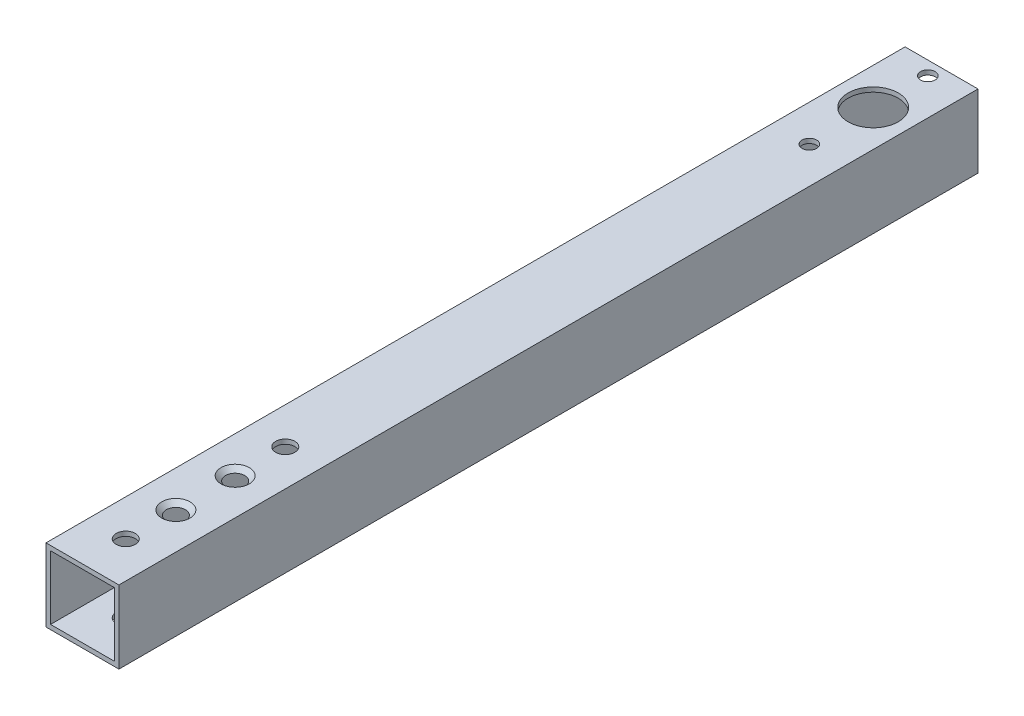
ISO-10303-21;
HEADER;
FILE_DESCRIPTION(('STEP AP214'),'2;1');
FILE_NAME('part.step','',(''),(''),'','','');
FILE_SCHEMA(('AUTOMOTIVE_DESIGN { 1 0 10303 214 1 1 1 1 }'));
ENDSEC;
DATA;
#1=APPLICATION_CONTEXT('core data for automotive mechanical design processes');
#2=APPLICATION_PROTOCOL_DEFINITION('international standard','automotive_design',2000,#1);
#3=PRODUCT_CONTEXT('',#1,'mechanical');
#4=PRODUCT('Part','Part','',(#3));
#5=PRODUCT_RELATED_PRODUCT_CATEGORY('part','',(#4));
#6=PRODUCT_DEFINITION_FORMATION('','',#4);
#7=PRODUCT_DEFINITION_CONTEXT('part definition',#1,'design');
#8=PRODUCT_DEFINITION('design','',#6,#7);
#9=PRODUCT_DEFINITION_SHAPE('','',#8);
#10=(LENGTH_UNIT() NAMED_UNIT(*) SI_UNIT(.MILLI.,.METRE.));
#11=(NAMED_UNIT(*) PLANE_ANGLE_UNIT() SI_UNIT($,.RADIAN.));
#12=(NAMED_UNIT(*) SI_UNIT($,.STERADIAN.) SOLID_ANGLE_UNIT());
#13=UNCERTAINTY_MEASURE_WITH_UNIT(LENGTH_MEASURE(1.E-05),#10,'distance_accuracy_value','');
#14=(GEOMETRIC_REPRESENTATION_CONTEXT(3) GLOBAL_UNCERTAINTY_ASSIGNED_CONTEXT((#13)) GLOBAL_UNIT_ASSIGNED_CONTEXT((#10,
#11,#12)) REPRESENTATION_CONTEXT('',''));
#15=CARTESIAN_POINT('',(0.,0.,0.));
#16=DIRECTION('',(0.,0.,1.));
#17=DIRECTION('',(1.,0.,0.));
#18=AXIS2_PLACEMENT_3D('',#15,#16,#17);
#19=CARTESIAN_POINT('',(8.,-8.,-86.1274169979696));
#20=DIRECTION('',(1.,0.,0.));
#21=DIRECTION('',(0.,0.,-1.));
#22=AXIS2_PLACEMENT_3D('',#19,#20,#21);
#23=PLANE('',#22);
#24=DIRECTION('',(0.,0.,1.));
#25=VECTOR('',#24,1.);
#26=CARTESIAN_POINT('',(8.,-8.,-86.1274169979696));
#27=LINE('',#26,#25);
#28=CARTESIAN_POINT('',(7.99999999999999,-8.,-63.5));
#29=VERTEX_POINT('',#28);
#30=CARTESIAN_POINT('',(8.,-8.,125.));
#31=VERTEX_POINT('',#30);
#32=EDGE_CURVE('E178',#29,#31,#27,.T.);
#33=ORIENTED_EDGE('',*,*,#32,.F.);
#34=DIRECTION('',(0.,1.,0.));
#35=VECTOR('',#34,1.);
#36=CARTESIAN_POINT('',(8.,-8.,-63.5));
#37=LINE('',#36,#35);
#38=CARTESIAN_POINT('',(8.,8.,-63.5));
#39=VERTEX_POINT('',#38);
#40=EDGE_CURVE('E175',#29,#39,#37,.T.);
#41=ORIENTED_EDGE('',*,*,#40,.T.);
#42=DIRECTION('',(0.,0.,1.));
#43=VECTOR('',#42,1.);
#44=CARTESIAN_POINT('',(8.,8.,-86.1274169979696));
#45=LINE('',#44,#43);
#46=CARTESIAN_POINT('',(8.,8.,125.));
#47=VERTEX_POINT('',#46);
#48=EDGE_CURVE('E179',#39,#47,#45,.T.);
#49=ORIENTED_EDGE('',*,*,#48,.T.);
#50=DIRECTION('',(0.,1.,0.));
#51=VECTOR('',#50,1.);
#52=CARTESIAN_POINT('',(8.,-8.,125.));
#53=LINE('',#52,#51);
#54=EDGE_CURVE('E161',#31,#47,#53,.T.);
#55=ORIENTED_EDGE('',*,*,#54,.F.);
#56=EDGE_LOOP('',(#33,#41,#49,#55));
#57=FACE_BOUND('',#56,.T.);
#58=ADVANCED_FACE('F48',(#57),#23,.T.);
#59=CARTESIAN_POINT('',(-8.,-8.,-86.1274169979696));
#60=DIRECTION('',(0.,-1.,0.));
#61=DIRECTION('',(0.,0.,-1.));
#62=AXIS2_PLACEMENT_3D('',#59,#60,#61);
#63=PLANE('',#62);
#64=CARTESIAN_POINT('',(0.,-8.,104.5));
#65=DIRECTION('',(0.,-1.,0.));
#66=DIRECTION('',(0.,0.,-1.));
#67=AXIS2_PLACEMENT_3D('',#64,#65,#66);
#68=CIRCLE('',#67,3.10000000000003);
#69=CARTESIAN_POINT('',(0.,-8.,101.4));
#70=VERTEX_POINT('',#69);
#71=EDGE_CURVE('E243',#70,#70,#68,.F.);
#72=ORIENTED_EDGE('',*,*,#71,.T.);
#73=EDGE_LOOP('',(#72));
#74=FACE_BOUND('',#73,.T.);
#75=CARTESIAN_POINT('',(0.,-8.,91.5));
#76=DIRECTION('',(0.,-1.,0.));
#77=DIRECTION('',(0.,0.,-1.));
#78=AXIS2_PLACEMENT_3D('',#75,#76,#77);
#79=CIRCLE('',#78,3.10000000000003);
#80=CARTESIAN_POINT('',(0.,-8.,88.3999999999999));
#81=VERTEX_POINT('',#80);
#82=EDGE_CURVE('E212',#81,#81,#79,.F.);
#83=ORIENTED_EDGE('',*,*,#82,.T.);
#84=EDGE_LOOP('',(#83));
#85=FACE_BOUND('',#84,.T.);
#86=CARTESIAN_POINT('',(0.,-8.,115.5));
#87=DIRECTION('',(0.,1.,0.));
#88=DIRECTION('',(0.,0.,1.));
#89=AXIS2_PLACEMENT_3D('',#86,#87,#88);
#90=CIRCLE('',#89,2.1);
#91=CARTESIAN_POINT('',(0.,-8.,117.6));
#92=VERTEX_POINT('',#91);
#93=EDGE_CURVE('E220',#92,#92,#90,.T.);
#94=ORIENTED_EDGE('',*,*,#93,.T.);
#95=EDGE_LOOP('',(#94));
#96=FACE_BOUND('',#95,.T.);
#97=CARTESIAN_POINT('',(0.,-8.,80.5));
#98=DIRECTION('',(0.,1.,0.));
#99=DIRECTION('',(0.,0.,1.));
#100=AXIS2_PLACEMENT_3D('',#97,#98,#99);
#101=CIRCLE('',#100,2.1);
#102=CARTESIAN_POINT('',(0.,-8.,82.6));
#103=VERTEX_POINT('',#102);
#104=EDGE_CURVE('E467',#103,#103,#101,.T.);
#105=ORIENTED_EDGE('',*,*,#104,.T.);
#106=EDGE_LOOP('',(#105));
#107=FACE_BOUND('',#106,.T.);
#108=CARTESIAN_POINT('',(0.,-8.,-48.5));
#109=DIRECTION('',(0.,1.,0.));
#110=DIRECTION('',(0.,0.,1.));
#111=AXIS2_PLACEMENT_3D('',#108,#109,#110);
#112=CIRCLE('',#111,5.5);
#113=CARTESIAN_POINT('',(0.,-8.,-43.));
#114=VERTEX_POINT('',#113);
#115=EDGE_CURVE('E394',#114,#114,#112,.T.);
#116=ORIENTED_EDGE('',*,*,#115,.T.);
#117=EDGE_LOOP('',(#116));
#118=FACE_BOUND('',#117,.T.);
#119=CARTESIAN_POINT('',(0.,-8.,-60.5));
#120=DIRECTION('',(0.,1.,0.));
#121=DIRECTION('',(0.,0.,1.));
#122=AXIS2_PLACEMENT_3D('',#119,#120,#121);
#123=CIRCLE('',#122,1.60000000000002);
#124=CARTESIAN_POINT('',(0.,-8.,-58.9));
#125=VERTEX_POINT('',#124);
#126=EDGE_CURVE('E458',#125,#125,#123,.T.);
#127=ORIENTED_EDGE('',*,*,#126,.T.);
#128=EDGE_LOOP('',(#127));
#129=FACE_BOUND('',#128,.T.);
#130=CARTESIAN_POINT('',(0.,-8.,-34.5));
#131=DIRECTION('',(0.,1.,0.));
#132=DIRECTION('',(0.,0.,1.));
#133=AXIS2_PLACEMENT_3D('',#130,#131,#132);
#134=CIRCLE('',#133,1.60000000000001);
#135=CARTESIAN_POINT('',(0.,-8.,-32.9));
#136=VERTEX_POINT('',#135);
#137=EDGE_CURVE('E404',#136,#136,#134,.T.);
#138=ORIENTED_EDGE('',*,*,#137,.T.);
#139=EDGE_LOOP('',(#138));
#140=FACE_BOUND('',#139,.T.);
#141=DIRECTION('',(0.,0.,1.));
#142=VECTOR('',#141,1.);
#143=CARTESIAN_POINT('',(-8.,-8.,-86.1274169979696));
#144=LINE('',#143,#142);
#145=CARTESIAN_POINT('',(-8.00000000000001,-8.,-63.5));
#146=VERTEX_POINT('',#145);
#147=CARTESIAN_POINT('',(-8.,-8.,125.));
#148=VERTEX_POINT('',#147);
#149=EDGE_CURVE('E185',#146,#148,#144,.T.);
#150=ORIENTED_EDGE('',*,*,#149,.F.);
#151=DIRECTION('',(1.,0.,0.));
#152=VECTOR('',#151,1.);
#153=CARTESIAN_POINT('',(-8.,-8.,-63.5));
#154=LINE('',#153,#152);
#155=EDGE_CURVE('E92',#146,#29,#154,.T.);
#156=ORIENTED_EDGE('',*,*,#155,.T.);
#157=ORIENTED_EDGE('',*,*,#32,.T.);
#158=DIRECTION('',(1.,0.,0.));
#159=VECTOR('',#158,1.);
#160=CARTESIAN_POINT('',(-8.,-8.,125.));
#161=LINE('',#160,#159);
#162=EDGE_CURVE('E172',#148,#31,#161,.T.);
#163=ORIENTED_EDGE('',*,*,#162,.F.);
#164=EDGE_LOOP('',(#150,#156,#157,#163));
#165=FACE_BOUND('',#164,.T.);
#166=ADVANCED_FACE('F313',(#74,#85,#96,#107,#118,#129,#140,#165),#63,.T.);
#167=CARTESIAN_POINT('',(-8.,-8.,-86.1274169979696));
#168=DIRECTION('',(-1.,0.,0.));
#169=DIRECTION('',(0.,0.,1.));
#170=AXIS2_PLACEMENT_3D('',#167,#168,#169);
#171=PLANE('',#170);
#172=DIRECTION('',(0.,0.,1.));
#173=VECTOR('',#172,1.);
#174=CARTESIAN_POINT('',(-8.,8.,-86.1274169979696));
#175=LINE('',#174,#173);
#176=CARTESIAN_POINT('',(-8.,8.,-63.5));
#177=VERTEX_POINT('',#176);
#178=CARTESIAN_POINT('',(-8.,8.,125.));
#179=VERTEX_POINT('',#178);
#180=EDGE_CURVE('E189',#177,#179,#175,.T.);
#181=ORIENTED_EDGE('',*,*,#180,.F.);
#182=DIRECTION('',(0.,-1.,0.));
#183=VECTOR('',#182,1.);
#184=CARTESIAN_POINT('',(-8.,-8.,-63.5));
#185=LINE('',#184,#183);
#186=EDGE_CURVE('E84',#177,#146,#185,.T.);
#187=ORIENTED_EDGE('',*,*,#186,.T.);
#188=ORIENTED_EDGE('',*,*,#149,.T.);
#189=DIRECTION('',(0.,-1.,0.));
#190=VECTOR('',#189,1.);
#191=CARTESIAN_POINT('',(-8.,-8.,125.));
#192=LINE('',#191,#190);
#193=EDGE_CURVE('E168',#179,#148,#192,.T.);
#194=ORIENTED_EDGE('',*,*,#193,.F.);
#195=EDGE_LOOP('',(#181,#187,#188,#194));
#196=FACE_BOUND('',#195,.T.);
#197=ADVANCED_FACE('F319',(#196),#171,.T.);
#198=CARTESIAN_POINT('',(-8.,8.,-86.1274169979696));
#199=DIRECTION('',(0.,1.,0.));
#200=DIRECTION('',(0.,0.,1.));
#201=AXIS2_PLACEMENT_3D('',#198,#199,#200);
#202=PLANE('',#201);
#203=CARTESIAN_POINT('',(0.,8.,104.5));
#204=DIRECTION('',(0.,1.,0.));
#205=DIRECTION('',(0.,0.,1.));
#206=AXIS2_PLACEMENT_3D('',#203,#204,#205);
#207=CIRCLE('',#206,3.10000000000002);
#208=CARTESIAN_POINT('',(0.,8.,107.6));
#209=VERTEX_POINT('',#208);
#210=EDGE_CURVE('E11',#209,#209,#207,.F.);
#211=ORIENTED_EDGE('',*,*,#210,.T.);
#212=EDGE_LOOP('',(#211));
#213=FACE_BOUND('',#212,.T.);
#214=CARTESIAN_POINT('',(0.,8.,91.5));
#215=DIRECTION('',(0.,1.,0.));
#216=DIRECTION('',(0.,0.,1.));
#217=AXIS2_PLACEMENT_3D('',#214,#215,#216);
#218=CIRCLE('',#217,3.10000000000002);
#219=CARTESIAN_POINT('',(0.,8.,94.6));
#220=VERTEX_POINT('',#219);
#221=EDGE_CURVE('E59',#220,#220,#218,.F.);
#222=ORIENTED_EDGE('',*,*,#221,.T.);
#223=EDGE_LOOP('',(#222));
#224=FACE_BOUND('',#223,.T.);
#225=CARTESIAN_POINT('',(0.,8.,115.5));
#226=DIRECTION('',(0.,1.,0.));
#227=DIRECTION('',(0.,0.,1.));
#228=AXIS2_PLACEMENT_3D('',#225,#226,#227);
#229=CIRCLE('',#228,2.1);
#230=CARTESIAN_POINT('',(0.,8.,117.6));
#231=VERTEX_POINT('',#230);
#232=EDGE_CURVE('E393',#231,#231,#229,.T.);
#233=ORIENTED_EDGE('',*,*,#232,.F.);
#234=EDGE_LOOP('',(#233));
#235=FACE_BOUND('',#234,.T.);
#236=CARTESIAN_POINT('',(0.,8.,80.5));
#237=DIRECTION('',(0.,1.,0.));
#238=DIRECTION('',(0.,0.,1.));
#239=AXIS2_PLACEMENT_3D('',#236,#237,#238);
#240=CIRCLE('',#239,2.1);
#241=CARTESIAN_POINT('',(0.,8.,82.6));
#242=VERTEX_POINT('',#241);
#243=EDGE_CURVE('E439',#242,#242,#240,.T.);
#244=ORIENTED_EDGE('',*,*,#243,.F.);
#245=EDGE_LOOP('',(#244));
#246=FACE_BOUND('',#245,.T.);
#247=CARTESIAN_POINT('',(0.,8.,-48.5));
#248=DIRECTION('',(0.,1.,0.));
#249=DIRECTION('',(0.,0.,1.));
#250=AXIS2_PLACEMENT_3D('',#247,#248,#249);
#251=CIRCLE('',#250,5.5);
#252=CARTESIAN_POINT('',(0.,8.,-43.));
#253=VERTEX_POINT('',#252);
#254=EDGE_CURVE('E390',#253,#253,#251,.T.);
#255=ORIENTED_EDGE('',*,*,#254,.F.);
#256=EDGE_LOOP('',(#255));
#257=FACE_BOUND('',#256,.T.);
#258=CARTESIAN_POINT('',(0.,8.,-60.5));
#259=DIRECTION('',(0.,1.,0.));
#260=DIRECTION('',(0.,0.,1.));
#261=AXIS2_PLACEMENT_3D('',#258,#259,#260);
#262=CIRCLE('',#261,1.60000000000002);
#263=CARTESIAN_POINT('',(0.,8.,-58.9));
#264=VERTEX_POINT('',#263);
#265=EDGE_CURVE('E401',#264,#264,#262,.T.);
#266=ORIENTED_EDGE('',*,*,#265,.F.);
#267=EDGE_LOOP('',(#266));
#268=FACE_BOUND('',#267,.T.);
#269=CARTESIAN_POINT('',(0.,8.,-34.5));
#270=DIRECTION('',(0.,1.,0.));
#271=DIRECTION('',(0.,0.,1.));
#272=AXIS2_PLACEMENT_3D('',#269,#270,#271);
#273=CIRCLE('',#272,1.60000000000001);
#274=CARTESIAN_POINT('',(0.,8.,-32.9));
#275=VERTEX_POINT('',#274);
#276=EDGE_CURVE('E446',#275,#275,#273,.T.);
#277=ORIENTED_EDGE('',*,*,#276,.F.);
#278=EDGE_LOOP('',(#277));
#279=FACE_BOUND('',#278,.T.);
#280=ORIENTED_EDGE('',*,*,#48,.F.);
#281=DIRECTION('',(-1.,0.,0.));
#282=VECTOR('',#281,1.);
#283=CARTESIAN_POINT('',(-8.,8.,-63.5));
#284=LINE('',#283,#282);
#285=EDGE_CURVE('E188',#39,#177,#284,.T.);
#286=ORIENTED_EDGE('',*,*,#285,.T.);
#287=ORIENTED_EDGE('',*,*,#180,.T.);
#288=DIRECTION('',(-1.,0.,0.));
#289=VECTOR('',#288,1.);
#290=CARTESIAN_POINT('',(-8.,8.,125.));
#291=LINE('',#290,#289);
#292=EDGE_CURVE('E164',#47,#179,#291,.T.);
#293=ORIENTED_EDGE('',*,*,#292,.F.);
#294=EDGE_LOOP('',(#280,#286,#287,#293));
#295=FACE_BOUND('',#294,.T.);
#296=ADVANCED_FACE('F267',(#213,#224,#235,#246,#257,#268,#279,#295),#202,.T.);
#297=CARTESIAN_POINT('',(7.,-7.,-86.1274169979696));
#298=DIRECTION('',(1.,0.,0.));
#299=DIRECTION('',(0.,0.,-1.));
#300=AXIS2_PLACEMENT_3D('',#297,#298,#299);
#301=PLANE('',#300);
#302=DIRECTION('',(0.,1.,0.));
#303=VECTOR('',#302,1.);
#304=CARTESIAN_POINT('',(7.,-7.,-63.5));
#305=LINE('',#304,#303);
#306=CARTESIAN_POINT('',(7.,-7.,-63.5));
#307=VERTEX_POINT('',#306);
#308=CARTESIAN_POINT('',(7.,7.,-63.5));
#309=VERTEX_POINT('',#308);
#310=EDGE_CURVE('E136',#307,#309,#305,.T.);
#311=ORIENTED_EDGE('',*,*,#310,.F.);
#312=DIRECTION('',(0.,0.,1.));
#313=VECTOR('',#312,1.);
#314=CARTESIAN_POINT('',(7.,-7.,-86.1274169979696));
#315=LINE('',#314,#313);
#316=CARTESIAN_POINT('',(7.,-7.,125.));
#317=VERTEX_POINT('',#316);
#318=EDGE_CURVE('E143',#307,#317,#315,.T.);
#319=ORIENTED_EDGE('',*,*,#318,.T.);
#320=DIRECTION('',(0.,1.,0.));
#321=VECTOR('',#320,1.);
#322=CARTESIAN_POINT('',(7.,-7.,125.));
#323=LINE('',#322,#321);
#324=CARTESIAN_POINT('',(7.,7.,125.));
#325=VERTEX_POINT('',#324);
#326=EDGE_CURVE('E140',#317,#325,#323,.T.);
#327=ORIENTED_EDGE('',*,*,#326,.T.);
#328=DIRECTION('',(0.,0.,1.));
#329=VECTOR('',#328,1.);
#330=CARTESIAN_POINT('',(7.,7.,-86.1274169979696));
#331=LINE('',#330,#329);
#332=EDGE_CURVE('E126',#309,#325,#331,.T.);
#333=ORIENTED_EDGE('',*,*,#332,.F.);
#334=EDGE_LOOP('',(#311,#319,#327,#333));
#335=FACE_BOUND('',#334,.T.);
#336=ADVANCED_FACE('F141',(#335),#301,.F.);
#337=CARTESIAN_POINT('',(-7.,-7.,-86.1274169979696));
#338=DIRECTION('',(0.,-1.,0.));
#339=DIRECTION('',(0.,0.,-1.));
#340=AXIS2_PLACEMENT_3D('',#337,#338,#339);
#341=PLANE('',#340);
#342=CARTESIAN_POINT('',(0.,-7.,104.5));
#343=DIRECTION('',(0.,-1.,0.));
#344=DIRECTION('',(0.,0.,-1.));
#345=AXIS2_PLACEMENT_3D('',#342,#343,#344);
#346=CIRCLE('',#345,2.10000000000002);
#347=CARTESIAN_POINT('',(0.,-7.,102.4));
#348=VERTEX_POINT('',#347);
#349=EDGE_CURVE('E251',#348,#348,#346,.T.);
#350=ORIENTED_EDGE('',*,*,#349,.T.);
#351=EDGE_LOOP('',(#350));
#352=FACE_BOUND('',#351,.T.);
#353=CARTESIAN_POINT('',(0.,-7.,91.5));
#354=DIRECTION('',(0.,-1.,0.));
#355=DIRECTION('',(0.,0.,-1.));
#356=AXIS2_PLACEMENT_3D('',#353,#354,#355);
#357=CIRCLE('',#356,2.10000000000002);
#358=CARTESIAN_POINT('',(0.,-7.,89.4));
#359=VERTEX_POINT('',#358);
#360=EDGE_CURVE('E247',#359,#359,#357,.T.);
#361=ORIENTED_EDGE('',*,*,#360,.T.);
#362=EDGE_LOOP('',(#361));
#363=FACE_BOUND('',#362,.T.);
#364=CARTESIAN_POINT('',(0.,-7.,115.5));
#365=DIRECTION('',(0.,-1.,0.));
#366=DIRECTION('',(0.,0.,-1.));
#367=AXIS2_PLACEMENT_3D('',#364,#365,#366);
#368=CIRCLE('',#367,2.1);
#369=CARTESIAN_POINT('',(0.,-7.,113.4));
#370=VERTEX_POINT('',#369);
#371=EDGE_CURVE('E147',#370,#370,#368,.T.);
#372=ORIENTED_EDGE('',*,*,#371,.T.);
#373=EDGE_LOOP('',(#372));
#374=FACE_BOUND('',#373,.T.);
#375=CARTESIAN_POINT('',(0.,-7.,80.5));
#376=DIRECTION('',(0.,-1.,0.));
#377=DIRECTION('',(0.,0.,-1.));
#378=AXIS2_PLACEMENT_3D('',#375,#376,#377);
#379=CIRCLE('',#378,2.1);
#380=CARTESIAN_POINT('',(0.,-7.,78.4));
#381=VERTEX_POINT('',#380);
#382=EDGE_CURVE('E235',#381,#381,#379,.T.);
#383=ORIENTED_EDGE('',*,*,#382,.T.);
#384=EDGE_LOOP('',(#383));
#385=FACE_BOUND('',#384,.T.);
#386=CARTESIAN_POINT('',(0.,-7.,-48.5));
#387=DIRECTION('',(0.,-1.,0.));
#388=DIRECTION('',(0.,0.,-1.));
#389=AXIS2_PLACEMENT_3D('',#386,#387,#388);
#390=CIRCLE('',#389,5.5);
#391=CARTESIAN_POINT('',(0.,-7.,-54.));
#392=VERTEX_POINT('',#391);
#393=EDGE_CURVE('E230',#392,#392,#390,.T.);
#394=ORIENTED_EDGE('',*,*,#393,.T.);
#395=EDGE_LOOP('',(#394));
#396=FACE_BOUND('',#395,.T.);
#397=CARTESIAN_POINT('',(0.,-7.,-60.5));
#398=DIRECTION('',(0.,-1.,0.));
#399=DIRECTION('',(0.,0.,-1.));
#400=AXIS2_PLACEMENT_3D('',#397,#398,#399);
#401=CIRCLE('',#400,1.60000000000002);
#402=CARTESIAN_POINT('',(0.,-7.,-62.1));
#403=VERTEX_POINT('',#402);
#404=EDGE_CURVE('E225',#403,#403,#401,.T.);
#405=ORIENTED_EDGE('',*,*,#404,.T.);
#406=EDGE_LOOP('',(#405));
#407=FACE_BOUND('',#406,.T.);
#408=CARTESIAN_POINT('',(0.,-7.,-34.5));
#409=DIRECTION('',(0.,-1.,0.));
#410=DIRECTION('',(0.,0.,-1.));
#411=AXIS2_PLACEMENT_3D('',#408,#409,#410);
#412=CIRCLE('',#411,1.60000000000001);
#413=CARTESIAN_POINT('',(0.,-7.,-36.1));
#414=VERTEX_POINT('',#413);
#415=EDGE_CURVE('E219',#414,#414,#412,.T.);
#416=ORIENTED_EDGE('',*,*,#415,.T.);
#417=EDGE_LOOP('',(#416));
#418=FACE_BOUND('',#417,.T.);
#419=DIRECTION('',(1.,0.,0.));
#420=VECTOR('',#419,1.);
#421=CARTESIAN_POINT('',(-7.,-7.,-63.5));
#422=LINE('',#421,#420);
#423=CARTESIAN_POINT('',(-7.,-7.,-63.5));
#424=VERTEX_POINT('',#423);
#425=EDGE_CURVE('E70',#424,#307,#422,.T.);
#426=ORIENTED_EDGE('',*,*,#425,.F.);
#427=DIRECTION('',(0.,0.,1.));
#428=VECTOR('',#427,1.);
#429=CARTESIAN_POINT('',(-7.,-7.,-86.1274169979696));
#430=LINE('',#429,#428);
#431=CARTESIAN_POINT('',(-7.,-7.,125.));
#432=VERTEX_POINT('',#431);
#433=EDGE_CURVE('E196',#424,#432,#430,.T.);
#434=ORIENTED_EDGE('',*,*,#433,.T.);
#435=DIRECTION('',(1.,0.,0.));
#436=VECTOR('',#435,1.);
#437=CARTESIAN_POINT('',(-7.,-7.,125.));
#438=LINE('',#437,#436);
#439=EDGE_CURVE('E156',#432,#317,#438,.T.);
#440=ORIENTED_EDGE('',*,*,#439,.T.);
#441=ORIENTED_EDGE('',*,*,#318,.F.);
#442=EDGE_LOOP('',(#426,#434,#440,#441));
#443=FACE_BOUND('',#442,.T.);
#444=ADVANCED_FACE('F327',(#352,#363,#374,#385,#396,#407,#418,#443),#341,.F.);
#445=CARTESIAN_POINT('',(-7.,-7.,-86.1274169979696));
#446=DIRECTION('',(-1.,0.,0.));
#447=DIRECTION('',(0.,0.,1.));
#448=AXIS2_PLACEMENT_3D('',#445,#446,#447);
#449=PLANE('',#448);
#450=DIRECTION('',(0.,-1.,0.));
#451=VECTOR('',#450,1.);
#452=CARTESIAN_POINT('',(-7.,-7.,-63.5));
#453=LINE('',#452,#451);
#454=CARTESIAN_POINT('',(-7.,7.,-63.5));
#455=VERTEX_POINT('',#454);
#456=EDGE_CURVE('E182',#455,#424,#453,.T.);
#457=ORIENTED_EDGE('',*,*,#456,.F.);
#458=DIRECTION('',(0.,0.,1.));
#459=VECTOR('',#458,1.);
#460=CARTESIAN_POINT('',(-7.,7.,-86.1274169979696));
#461=LINE('',#460,#459);
#462=CARTESIAN_POINT('',(-7.,7.,125.));
#463=VERTEX_POINT('',#462);
#464=EDGE_CURVE('E137',#455,#463,#461,.T.);
#465=ORIENTED_EDGE('',*,*,#464,.T.);
#466=DIRECTION('',(0.,-1.,0.));
#467=VECTOR('',#466,1.);
#468=CARTESIAN_POINT('',(-7.,-7.,125.));
#469=LINE('',#468,#467);
#470=EDGE_CURVE('E151',#463,#432,#469,.T.);
#471=ORIENTED_EDGE('',*,*,#470,.T.);
#472=ORIENTED_EDGE('',*,*,#433,.F.);
#473=EDGE_LOOP('',(#457,#465,#471,#472));
#474=FACE_BOUND('',#473,.T.);
#475=ADVANCED_FACE('F278',(#474),#449,.F.);
#476=CARTESIAN_POINT('',(-7.,7.,-86.1274169979696));
#477=DIRECTION('',(0.,1.,0.));
#478=DIRECTION('',(0.,0.,1.));
#479=AXIS2_PLACEMENT_3D('',#476,#477,#478);
#480=PLANE('',#479);
#481=CARTESIAN_POINT('',(0.,7.,104.5));
#482=DIRECTION('',(0.,1.,0.));
#483=DIRECTION('',(0.,0.,1.));
#484=AXIS2_PLACEMENT_3D('',#481,#482,#483);
#485=CIRCLE('',#484,2.10000000000003);
#486=CARTESIAN_POINT('',(0.,7.,106.6));
#487=VERTEX_POINT('',#486);
#488=EDGE_CURVE('E259',#487,#487,#485,.T.);
#489=ORIENTED_EDGE('',*,*,#488,.T.);
#490=EDGE_LOOP('',(#489));
#491=FACE_BOUND('',#490,.T.);
#492=CARTESIAN_POINT('',(0.,7.,91.5));
#493=DIRECTION('',(0.,1.,0.));
#494=DIRECTION('',(0.,0.,1.));
#495=AXIS2_PLACEMENT_3D('',#492,#493,#494);
#496=CIRCLE('',#495,2.10000000000003);
#497=CARTESIAN_POINT('',(0.,7.,93.6));
#498=VERTEX_POINT('',#497);
#499=EDGE_CURVE('E255',#498,#498,#496,.T.);
#500=ORIENTED_EDGE('',*,*,#499,.T.);
#501=EDGE_LOOP('',(#500));
#502=FACE_BOUND('',#501,.T.);
#503=CARTESIAN_POINT('',(0.,7.,115.5));
#504=DIRECTION('',(0.,1.,0.));
#505=DIRECTION('',(0.,0.,1.));
#506=AXIS2_PLACEMENT_3D('',#503,#504,#505);
#507=CIRCLE('',#506,2.1);
#508=CARTESIAN_POINT('',(0.,7.,117.6));
#509=VERTEX_POINT('',#508);
#510=EDGE_CURVE('E236',#509,#509,#507,.T.);
#511=ORIENTED_EDGE('',*,*,#510,.T.);
#512=EDGE_LOOP('',(#511));
#513=FACE_BOUND('',#512,.T.);
#514=CARTESIAN_POINT('',(0.,7.,80.5));
#515=DIRECTION('',(0.,1.,0.));
#516=DIRECTION('',(0.,0.,1.));
#517=AXIS2_PLACEMENT_3D('',#514,#515,#516);
#518=CIRCLE('',#517,2.1);
#519=CARTESIAN_POINT('',(0.,7.,82.6));
#520=VERTEX_POINT('',#519);
#521=EDGE_CURVE('E231',#520,#520,#518,.T.);
#522=ORIENTED_EDGE('',*,*,#521,.T.);
#523=EDGE_LOOP('',(#522));
#524=FACE_BOUND('',#523,.T.);
#525=CARTESIAN_POINT('',(0.,7.,-48.5));
#526=DIRECTION('',(0.,1.,0.));
#527=DIRECTION('',(0.,0.,1.));
#528=AXIS2_PLACEMENT_3D('',#525,#526,#527);
#529=CIRCLE('',#528,5.5);
#530=CARTESIAN_POINT('',(0.,7.,-43.));
#531=VERTEX_POINT('',#530);
#532=EDGE_CURVE('E226',#531,#531,#529,.T.);
#533=ORIENTED_EDGE('',*,*,#532,.T.);
#534=EDGE_LOOP('',(#533));
#535=FACE_BOUND('',#534,.T.);
#536=CARTESIAN_POINT('',(0.,7.,-60.5));
#537=DIRECTION('',(0.,1.,0.));
#538=DIRECTION('',(0.,0.,1.));
#539=AXIS2_PLACEMENT_3D('',#536,#537,#538);
#540=CIRCLE('',#539,1.60000000000002);
#541=CARTESIAN_POINT('',(0.,7.,-58.9));
#542=VERTEX_POINT('',#541);
#543=EDGE_CURVE('E221',#542,#542,#540,.T.);
#544=ORIENTED_EDGE('',*,*,#543,.T.);
#545=EDGE_LOOP('',(#544));
#546=FACE_BOUND('',#545,.T.);
#547=CARTESIAN_POINT('',(0.,7.,-34.5));
#548=DIRECTION('',(0.,1.,0.));
#549=DIRECTION('',(0.,0.,1.));
#550=AXIS2_PLACEMENT_3D('',#547,#548,#549);
#551=CIRCLE('',#550,1.60000000000001);
#552=CARTESIAN_POINT('',(0.,7.,-32.9));
#553=VERTEX_POINT('',#552);
#554=EDGE_CURVE('E215',#553,#553,#551,.T.);
#555=ORIENTED_EDGE('',*,*,#554,.T.);
#556=EDGE_LOOP('',(#555));
#557=FACE_BOUND('',#556,.T.);
#558=DIRECTION('',(-1.,0.,0.));
#559=VECTOR('',#558,1.);
#560=CARTESIAN_POINT('',(-7.,7.,-63.5));
#561=LINE('',#560,#559);
#562=EDGE_CURVE('E133',#309,#455,#561,.T.);
#563=ORIENTED_EDGE('',*,*,#562,.F.);
#564=ORIENTED_EDGE('',*,*,#332,.T.);
#565=DIRECTION('',(-1.,0.,0.));
#566=VECTOR('',#565,1.);
#567=CARTESIAN_POINT('',(-7.,7.,125.));
#568=LINE('',#567,#566);
#569=EDGE_CURVE('E131',#325,#463,#568,.T.);
#570=ORIENTED_EDGE('',*,*,#569,.T.);
#571=ORIENTED_EDGE('',*,*,#464,.F.);
#572=EDGE_LOOP('',(#563,#564,#570,#571));
#573=FACE_BOUND('',#572,.T.);
#574=ADVANCED_FACE('F128',(#491,#502,#513,#524,#535,#546,#557,#573),#480,.F.);
#575=CARTESIAN_POINT('',(15.9996874969482,12.,-63.5));
#576=DIRECTION('',(0.,0.,-1.));
#577=DIRECTION('',(-1.,0.,0.));
#578=AXIS2_PLACEMENT_3D('',#575,#576,#577);
#579=PLANE('',#578);
#580=ORIENTED_EDGE('',*,*,#155,.F.);
#581=ORIENTED_EDGE('',*,*,#186,.F.);
#582=ORIENTED_EDGE('',*,*,#285,.F.);
#583=ORIENTED_EDGE('',*,*,#40,.F.);
#584=EDGE_LOOP('',(#580,#581,#582,#583));
#585=FACE_BOUND('',#584,.T.);
#586=ORIENTED_EDGE('',*,*,#310,.T.);
#587=ORIENTED_EDGE('',*,*,#562,.T.);
#588=ORIENTED_EDGE('',*,*,#456,.T.);
#589=ORIENTED_EDGE('',*,*,#425,.T.);
#590=EDGE_LOOP('',(#586,#587,#588,#589));
#591=FACE_BOUND('',#590,.T.);
#592=ADVANCED_FACE('F277',(#585,#591),#579,.T.);
#593=CARTESIAN_POINT('',(0.,0.,125.));
#594=DIRECTION('',(0.,0.,-1.));
#595=DIRECTION('',(-1.,0.,0.));
#596=AXIS2_PLACEMENT_3D('',#593,#594,#595);
#597=PLANE('',#596);
#598=ORIENTED_EDGE('',*,*,#54,.T.);
#599=ORIENTED_EDGE('',*,*,#292,.T.);
#600=ORIENTED_EDGE('',*,*,#193,.T.);
#601=ORIENTED_EDGE('',*,*,#162,.T.);
#602=EDGE_LOOP('',(#598,#599,#600,#601));
#603=FACE_BOUND('',#602,.T.);
#604=ORIENTED_EDGE('',*,*,#326,.F.);
#605=ORIENTED_EDGE('',*,*,#439,.F.);
#606=ORIENTED_EDGE('',*,*,#470,.F.);
#607=ORIENTED_EDGE('',*,*,#569,.F.);
#608=EDGE_LOOP('',(#604,#605,#606,#607));
#609=FACE_BOUND('',#608,.T.);
#610=ADVANCED_FACE('F149',(#603,#609),#597,.F.);
#611=CARTESIAN_POINT('',(0.,-8.,-34.5));
#612=DIRECTION('',(0.,1.,0.));
#613=DIRECTION('',(0.,0.,1.));
#614=AXIS2_PLACEMENT_3D('',#611,#612,#613);
#615=CYLINDRICAL_SURFACE('',#614,1.60000000000001);
#616=ORIENTED_EDGE('',*,*,#276,.T.);
#617=EDGE_LOOP('',(#616));
#618=FACE_BOUND('',#617,.T.);
#619=ORIENTED_EDGE('',*,*,#554,.F.);
#620=EDGE_LOOP('',(#619));
#621=FACE_BOUND('',#620,.T.);
#622=ADVANCED_FACE('F291',(#618,#621),#615,.F.);
#623=CARTESIAN_POINT('',(0.,-8.,-60.5));
#624=DIRECTION('',(0.,1.,0.));
#625=DIRECTION('',(0.,0.,1.));
#626=AXIS2_PLACEMENT_3D('',#623,#624,#625);
#627=CYLINDRICAL_SURFACE('',#626,1.60000000000002);
#628=ORIENTED_EDGE('',*,*,#265,.T.);
#629=EDGE_LOOP('',(#628));
#630=FACE_BOUND('',#629,.T.);
#631=ORIENTED_EDGE('',*,*,#543,.F.);
#632=EDGE_LOOP('',(#631));
#633=FACE_BOUND('',#632,.T.);
#634=ADVANCED_FACE('F293',(#630,#633),#627,.F.);
#635=CARTESIAN_POINT('',(0.,-8.,-48.5));
#636=DIRECTION('',(0.,1.,0.));
#637=DIRECTION('',(0.,0.,1.));
#638=AXIS2_PLACEMENT_3D('',#635,#636,#637);
#639=CYLINDRICAL_SURFACE('',#638,5.5);
#640=ORIENTED_EDGE('',*,*,#254,.T.);
#641=EDGE_LOOP('',(#640));
#642=FACE_BOUND('',#641,.T.);
#643=ORIENTED_EDGE('',*,*,#532,.F.);
#644=EDGE_LOOP('',(#643));
#645=FACE_BOUND('',#644,.T.);
#646=ADVANCED_FACE('F301',(#642,#645),#639,.F.);
#647=CARTESIAN_POINT('',(0.,-8.,80.5));
#648=DIRECTION('',(0.,1.,0.));
#649=DIRECTION('',(0.,0.,1.));
#650=AXIS2_PLACEMENT_3D('',#647,#648,#649);
#651=CYLINDRICAL_SURFACE('',#650,2.1);
#652=ORIENTED_EDGE('',*,*,#243,.T.);
#653=EDGE_LOOP('',(#652));
#654=FACE_BOUND('',#653,.T.);
#655=ORIENTED_EDGE('',*,*,#521,.F.);
#656=EDGE_LOOP('',(#655));
#657=FACE_BOUND('',#656,.T.);
#658=ADVANCED_FACE('F377',(#654,#657),#651,.F.);
#659=CARTESIAN_POINT('',(0.,-8.,115.5));
#660=DIRECTION('',(0.,1.,0.));
#661=DIRECTION('',(0.,0.,1.));
#662=AXIS2_PLACEMENT_3D('',#659,#660,#661);
#663=CYLINDRICAL_SURFACE('',#662,2.1);
#664=ORIENTED_EDGE('',*,*,#232,.T.);
#665=EDGE_LOOP('',(#664));
#666=FACE_BOUND('',#665,.T.);
#667=ORIENTED_EDGE('',*,*,#510,.F.);
#668=EDGE_LOOP('',(#667));
#669=FACE_BOUND('',#668,.T.);
#670=ADVANCED_FACE('F310',(#666,#669),#663,.F.);
#671=ORIENTED_EDGE('',*,*,#137,.F.);
#672=EDGE_LOOP('',(#671));
#673=FACE_BOUND('',#672,.T.);
#674=ORIENTED_EDGE('',*,*,#415,.F.);
#675=EDGE_LOOP('',(#674));
#676=FACE_BOUND('',#675,.T.);
#677=ADVANCED_FACE('F296',(#673,#676),#615,.F.);
#678=ORIENTED_EDGE('',*,*,#126,.F.);
#679=EDGE_LOOP('',(#678));
#680=FACE_BOUND('',#679,.T.);
#681=ORIENTED_EDGE('',*,*,#404,.F.);
#682=EDGE_LOOP('',(#681));
#683=FACE_BOUND('',#682,.T.);
#684=ADVANCED_FACE('F304',(#680,#683),#627,.F.);
#685=ORIENTED_EDGE('',*,*,#115,.F.);
#686=EDGE_LOOP('',(#685));
#687=FACE_BOUND('',#686,.T.);
#688=ORIENTED_EDGE('',*,*,#393,.F.);
#689=EDGE_LOOP('',(#688));
#690=FACE_BOUND('',#689,.T.);
#691=ADVANCED_FACE('F367',(#687,#690),#639,.F.);
#692=ORIENTED_EDGE('',*,*,#104,.F.);
#693=EDGE_LOOP('',(#692));
#694=FACE_BOUND('',#693,.T.);
#695=ORIENTED_EDGE('',*,*,#382,.F.);
#696=EDGE_LOOP('',(#695));
#697=FACE_BOUND('',#696,.T.);
#698=ADVANCED_FACE('F369',(#694,#697),#651,.F.);
#699=ORIENTED_EDGE('',*,*,#93,.F.);
#700=EDGE_LOOP('',(#699));
#701=FACE_BOUND('',#700,.T.);
#702=ORIENTED_EDGE('',*,*,#371,.F.);
#703=EDGE_LOOP('',(#702));
#704=FACE_BOUND('',#703,.T.);
#705=ADVANCED_FACE('F344',(#701,#704),#663,.F.);
#706=CARTESIAN_POINT('',(0.,-8.,104.5));
#707=DIRECTION('',(0.,-1.,0.));
#708=DIRECTION('',(0.,0.,-1.));
#709=AXIS2_PLACEMENT_3D('',#706,#707,#708);
#710=CONICAL_SURFACE('',#709,3.10000000000003,0.785398163397454);
#711=ORIENTED_EDGE('',*,*,#349,.F.);
#712=EDGE_LOOP('',(#711));
#713=FACE_BOUND('',#712,.T.);
#714=ORIENTED_EDGE('',*,*,#71,.F.);
#715=EDGE_LOOP('',(#714));
#716=FACE_BOUND('',#715,.T.);
#717=ADVANCED_FACE('F337',(#713,#716),#710,.F.);
#718=CARTESIAN_POINT('',(0.,-8.,91.5));
#719=DIRECTION('',(0.,-1.,0.));
#720=DIRECTION('',(0.,0.,-1.));
#721=AXIS2_PLACEMENT_3D('',#718,#719,#720);
#722=CONICAL_SURFACE('',#721,3.10000000000003,0.785398163397453);
#723=ORIENTED_EDGE('',*,*,#360,.F.);
#724=EDGE_LOOP('',(#723));
#725=FACE_BOUND('',#724,.T.);
#726=ORIENTED_EDGE('',*,*,#82,.F.);
#727=EDGE_LOOP('',(#726));
#728=FACE_BOUND('',#727,.T.);
#729=ADVANCED_FACE('F343',(#725,#728),#722,.F.);
#730=CARTESIAN_POINT('',(0.,6.49999999999997,104.5));
#731=DIRECTION('',(0.,1.,0.));
#732=DIRECTION('',(0.,0.,1.));
#733=AXIS2_PLACEMENT_3D('',#730,#731,#732);
#734=CONICAL_SURFACE('',#733,1.6,0.785398163397445);
#735=ORIENTED_EDGE('',*,*,#210,.F.);
#736=EDGE_LOOP('',(#735));
#737=FACE_BOUND('',#736,.T.);
#738=ORIENTED_EDGE('',*,*,#488,.F.);
#739=EDGE_LOOP('',(#738));
#740=FACE_BOUND('',#739,.T.);
#741=ADVANCED_FACE('F272',(#737,#740),#734,.F.);
#742=CARTESIAN_POINT('',(0.,6.49999999999997,91.5));
#743=DIRECTION('',(0.,1.,0.));
#744=DIRECTION('',(0.,0.,1.));
#745=AXIS2_PLACEMENT_3D('',#742,#743,#744);
#746=CONICAL_SURFACE('',#745,1.60000000000001,0.785398163397444);
#747=ORIENTED_EDGE('',*,*,#221,.F.);
#748=EDGE_LOOP('',(#747));
#749=FACE_BOUND('',#748,.T.);
#750=ORIENTED_EDGE('',*,*,#499,.F.);
#751=EDGE_LOOP('',(#750));
#752=FACE_BOUND('',#751,.T.);
#753=ADVANCED_FACE('F51',(#749,#752),#746,.F.);
#754=CLOSED_SHELL('',(#58,#166,#197,#296,#336,#444,#475,#574,#592,#610,#622,#634,#646,#658,#670,
#677,#684,#691,#698,#705,#717,#729,#741,#753));
#755=MANIFOLD_SOLID_BREP('B2',#754);
#756=ADVANCED_BREP_SHAPE_REPRESENTATION('',(#18,#755),#14);
#757=SHAPE_DEFINITION_REPRESENTATION(#9,#756);
ENDSEC;
END-ISO-10303-21;
